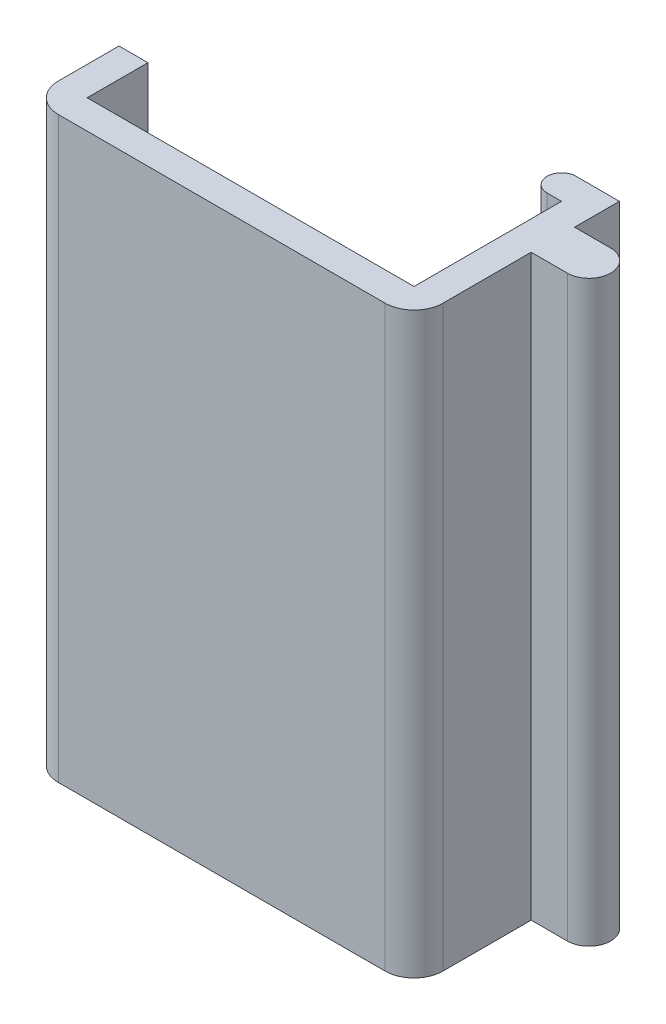
ISO-10303-21;
HEADER;
FILE_DESCRIPTION(('STEP AP214'),'2;1');
FILE_NAME('part.step','',(''),(''),'','','');
FILE_SCHEMA(('AUTOMOTIVE_DESIGN { 1 0 10303 214 1 1 1 1 }'));
ENDSEC;
DATA;
#1=APPLICATION_CONTEXT('core data for automotive mechanical design processes');
#2=APPLICATION_PROTOCOL_DEFINITION('international standard','automotive_design',2000,#1);
#3=PRODUCT_CONTEXT('',#1,'mechanical');
#4=PRODUCT('Part','Part','',(#3));
#5=PRODUCT_RELATED_PRODUCT_CATEGORY('part','',(#4));
#6=PRODUCT_DEFINITION_FORMATION('','',#4);
#7=PRODUCT_DEFINITION_CONTEXT('part definition',#1,'design');
#8=PRODUCT_DEFINITION('design','',#6,#7);
#9=PRODUCT_DEFINITION_SHAPE('','',#8);
#10=(LENGTH_UNIT() NAMED_UNIT(*) SI_UNIT(.MILLI.,.METRE.));
#11=(NAMED_UNIT(*) PLANE_ANGLE_UNIT() SI_UNIT($,.RADIAN.));
#12=(NAMED_UNIT(*) SI_UNIT($,.STERADIAN.) SOLID_ANGLE_UNIT());
#13=UNCERTAINTY_MEASURE_WITH_UNIT(LENGTH_MEASURE(1.E-05),#10,'distance_accuracy_value','');
#14=(GEOMETRIC_REPRESENTATION_CONTEXT(3) GLOBAL_UNCERTAINTY_ASSIGNED_CONTEXT((#13)) GLOBAL_UNIT_ASSIGNED_CONTEXT((#10,
#11,#12)) REPRESENTATION_CONTEXT('',''));
#15=CARTESIAN_POINT('',(0.,0.,0.));
#16=DIRECTION('',(0.,0.,1.));
#17=DIRECTION('',(1.,0.,0.));
#18=AXIS2_PLACEMENT_3D('',#15,#16,#17);
#19=CARTESIAN_POINT('',(10.5325860268922,20.,-1.7));
#20=DIRECTION('',(0.,1.,0.));
#21=DIRECTION('',(0.,0.,1.));
#22=AXIS2_PLACEMENT_3D('',#19,#20,#21);
#23=CYLINDRICAL_SURFACE('',#22,0.75);
#24=DIRECTION('',(0.,-1.,0.));
#25=VECTOR('',#24,1.);
#26=CARTESIAN_POINT('',(10.5325860268922,20.,-2.45));
#27=LINE('',#26,#25);
#28=CARTESIAN_POINT('',(10.5325860268922,20.,-2.45));
#29=VERTEX_POINT('',#28);
#30=CARTESIAN_POINT('',(10.5325860268922,0.,-2.45000000000001));
#31=VERTEX_POINT('',#30);
#32=EDGE_CURVE('E157',#29,#31,#27,.T.);
#33=ORIENTED_EDGE('',*,*,#32,.F.);
#34=CARTESIAN_POINT('',(10.5325860268922,20.,-1.7));
#35=DIRECTION('',(0.,1.,0.));
#36=DIRECTION('',(0.,0.,1.));
#37=AXIS2_PLACEMENT_3D('',#34,#35,#36);
#38=CIRCLE('',#37,0.75);
#39=CARTESIAN_POINT('',(10.5325860268922,20.,-0.950000000000003));
#40=VERTEX_POINT('',#39);
#41=EDGE_CURVE('E49',#40,#29,#38,.T.);
#42=ORIENTED_EDGE('',*,*,#41,.F.);
#43=DIRECTION('',(0.,-1.,0.));
#44=VECTOR('',#43,1.);
#45=CARTESIAN_POINT('',(10.5325860268922,20.,-0.950000000000003));
#46=LINE('',#45,#44);
#47=CARTESIAN_POINT('',(10.5325860268922,0.,-0.950000000000003));
#48=VERTEX_POINT('',#47);
#49=EDGE_CURVE('E271',#48,#40,#46,.F.);
#50=ORIENTED_EDGE('',*,*,#49,.F.);
#51=CARTESIAN_POINT('',(10.5325860268922,0.,-1.70000000000001));
#52=DIRECTION('',(0.,1.,0.));
#53=DIRECTION('',(0.,0.,1.));
#54=AXIS2_PLACEMENT_3D('',#51,#52,#53);
#55=CIRCLE('',#54,0.75);
#56=EDGE_CURVE('E11',#31,#48,#55,.F.);
#57=ORIENTED_EDGE('',*,*,#56,.F.);
#58=EDGE_LOOP('',(#33,#42,#50,#57));
#59=FACE_BOUND('',#58,.T.);
#60=ADVANCED_FACE('F41',(#59),#23,.T.);
#61=CARTESIAN_POINT('',(9.28258602689219,20.,3.1));
#62=DIRECTION('',(-1.,0.,0.));
#63=DIRECTION('',(0.,0.,1.));
#64=AXIS2_PLACEMENT_3D('',#61,#62,#63);
#65=PLANE('',#64);
#66=DIRECTION('',(0.,-1.,0.));
#67=VECTOR('',#66,1.);
#68=CARTESIAN_POINT('',(9.28258602689219,20.,-0.950000000000003));
#69=LINE('',#68,#67);
#70=CARTESIAN_POINT('',(9.28258602689218,20.,-0.950000000000002));
#71=VERTEX_POINT('',#70);
#72=CARTESIAN_POINT('',(9.28258602689218,0.,-0.950000000000002));
#73=VERTEX_POINT('',#72);
#74=EDGE_CURVE('E176',#71,#73,#69,.T.);
#75=ORIENTED_EDGE('',*,*,#74,.F.);
#76=DIRECTION('',(0.,0.,-1.));
#77=VECTOR('',#76,1.);
#78=CARTESIAN_POINT('',(9.28258602689219,20.,3.1));
#79=LINE('',#78,#77);
#80=CARTESIAN_POINT('',(9.28258602689219,20.,2.1));
#81=VERTEX_POINT('',#80);
#82=EDGE_CURVE('E197',#81,#71,#79,.T.);
#83=ORIENTED_EDGE('',*,*,#82,.F.);
#84=DIRECTION('',(0.,1.,0.));
#85=VECTOR('',#84,1.);
#86=CARTESIAN_POINT('',(9.28258602689219,20.,2.1));
#87=LINE('',#86,#85);
#88=CARTESIAN_POINT('',(9.28258602689219,0.,2.1));
#89=VERTEX_POINT('',#88);
#90=EDGE_CURVE('E263',#81,#89,#87,.F.);
#91=ORIENTED_EDGE('',*,*,#90,.T.);
#92=DIRECTION('',(0.,0.,-1.));
#93=VECTOR('',#92,1.);
#94=CARTESIAN_POINT('',(9.28258602689219,0.,3.1));
#95=LINE('',#94,#93);
#96=EDGE_CURVE('E169',#89,#73,#95,.T.);
#97=ORIENTED_EDGE('',*,*,#96,.T.);
#98=EDGE_LOOP('',(#75,#83,#91,#97));
#99=FACE_BOUND('',#98,.T.);
#100=ADVANCED_FACE('F281',(#99),#65,.F.);
#101=DIRECTION('',(0.,1.,0.));
#102=VECTOR('',#101,1.);
#103=CARTESIAN_POINT('',(9.28258602689219,20.,-2.45));
#104=LINE('',#103,#102);
#105=CARTESIAN_POINT('',(9.28258602689219,0.,-2.45000000000001));
#106=VERTEX_POINT('',#105);
#107=CARTESIAN_POINT('',(9.28258602689218,20.,-2.45));
#108=VERTEX_POINT('',#107);
#109=EDGE_CURVE('E156',#106,#108,#104,.T.);
#110=ORIENTED_EDGE('',*,*,#109,.F.);
#111=CARTESIAN_POINT('',(9.28258602689218,0.,-4.));
#112=VERTEX_POINT('',#111);
#113=EDGE_CURVE('E162',#106,#112,#95,.T.);
#114=ORIENTED_EDGE('',*,*,#113,.T.);
#115=DIRECTION('',(0.,-1.,0.));
#116=VECTOR('',#115,1.);
#117=CARTESIAN_POINT('',(9.28258602689218,20.,-4.));
#118=LINE('',#117,#116);
#119=CARTESIAN_POINT('',(9.28258602689218,20.,-4.));
#120=VERTEX_POINT('',#119);
#121=EDGE_CURVE('E235',#120,#112,#118,.T.);
#122=ORIENTED_EDGE('',*,*,#121,.F.);
#123=EDGE_CURVE('E174',#108,#120,#79,.T.);
#124=ORIENTED_EDGE('',*,*,#123,.F.);
#125=EDGE_LOOP('',(#110,#114,#122,#124));
#126=FACE_BOUND('',#125,.T.);
#127=ADVANCED_FACE('F173',(#126),#65,.F.);
#128=CARTESIAN_POINT('',(8.28258602689219,20.,2.1));
#129=DIRECTION('',(0.,1.,0.));
#130=DIRECTION('',(0.,0.,1.));
#131=AXIS2_PLACEMENT_3D('',#128,#129,#130);
#132=CYLINDRICAL_SURFACE('',#131,1.);
#133=DIRECTION('',(0.,1.,0.));
#134=VECTOR('',#133,1.);
#135=CARTESIAN_POINT('',(8.28258602689219,20.,3.1));
#136=LINE('',#135,#134);
#137=CARTESIAN_POINT('',(8.28258602689219,0.,3.1));
#138=VERTEX_POINT('',#137);
#139=CARTESIAN_POINT('',(8.28258602689219,20.,3.1));
#140=VERTEX_POINT('',#139);
#141=EDGE_CURVE('E260',#138,#140,#136,.T.);
#142=ORIENTED_EDGE('',*,*,#141,.F.);
#143=CARTESIAN_POINT('',(8.28258602689219,0.,2.1));
#144=DIRECTION('',(0.,1.,0.));
#145=DIRECTION('',(0.,0.,1.));
#146=AXIS2_PLACEMENT_3D('',#143,#144,#145);
#147=CIRCLE('',#146,1.);
#148=EDGE_CURVE('E266',#89,#138,#147,.F.);
#149=ORIENTED_EDGE('',*,*,#148,.F.);
#150=ORIENTED_EDGE('',*,*,#90,.F.);
#151=CARTESIAN_POINT('',(8.28258602689219,20.,2.1));
#152=DIRECTION('',(0.,1.,0.));
#153=DIRECTION('',(0.,0.,1.));
#154=AXIS2_PLACEMENT_3D('',#151,#152,#153);
#155=CIRCLE('',#154,1.);
#156=EDGE_CURVE('E268',#140,#81,#155,.T.);
#157=ORIENTED_EDGE('',*,*,#156,.F.);
#158=EDGE_LOOP('',(#142,#149,#150,#157));
#159=FACE_BOUND('',#158,.T.);
#160=ADVANCED_FACE('F286',(#159),#132,.T.);
#161=CARTESIAN_POINT('',(-3.01741397310781,20.,2.1));
#162=DIRECTION('',(0.,1.,0.));
#163=DIRECTION('',(0.,0.,1.));
#164=AXIS2_PLACEMENT_3D('',#161,#162,#163);
#165=CYLINDRICAL_SURFACE('',#164,1.);
#166=DIRECTION('',(0.,1.,0.));
#167=VECTOR('',#166,1.);
#168=CARTESIAN_POINT('',(-4.01741397310781,20.,2.1));
#169=LINE('',#168,#167);
#170=CARTESIAN_POINT('',(-4.01741397310781,0.,2.1));
#171=VERTEX_POINT('',#170);
#172=CARTESIAN_POINT('',(-4.01741397310781,20.,2.1));
#173=VERTEX_POINT('',#172);
#174=EDGE_CURVE('E250',#171,#173,#169,.T.);
#175=ORIENTED_EDGE('',*,*,#174,.F.);
#176=CARTESIAN_POINT('',(-3.01741397310781,0.,2.1));
#177=DIRECTION('',(0.,1.,0.));
#178=DIRECTION('',(0.,0.,1.));
#179=AXIS2_PLACEMENT_3D('',#176,#177,#178);
#180=CIRCLE('',#179,1.);
#181=CARTESIAN_POINT('',(-3.01741397310781,0.,3.1));
#182=VERTEX_POINT('',#181);
#183=EDGE_CURVE('E256',#182,#171,#180,.F.);
#184=ORIENTED_EDGE('',*,*,#183,.F.);
#185=DIRECTION('',(0.,1.,0.));
#186=VECTOR('',#185,1.);
#187=CARTESIAN_POINT('',(-3.01741397310781,20.,3.1));
#188=LINE('',#187,#186);
#189=CARTESIAN_POINT('',(-3.01741397310781,20.,3.1));
#190=VERTEX_POINT('',#189);
#191=EDGE_CURVE('E253',#190,#182,#188,.F.);
#192=ORIENTED_EDGE('',*,*,#191,.F.);
#193=CARTESIAN_POINT('',(-3.01741397310781,20.,2.1));
#194=DIRECTION('',(0.,1.,0.));
#195=DIRECTION('',(0.,0.,1.));
#196=AXIS2_PLACEMENT_3D('',#193,#194,#195);
#197=CIRCLE('',#196,1.);
#198=EDGE_CURVE('E258',#173,#190,#197,.T.);
#199=ORIENTED_EDGE('',*,*,#198,.F.);
#200=EDGE_LOOP('',(#175,#184,#192,#199));
#201=FACE_BOUND('',#200,.T.);
#202=ADVANCED_FACE('F295',(#201),#165,.T.);
#203=CARTESIAN_POINT('',(7.78258602689218,20.,-3.5));
#204=DIRECTION('',(0.,-1.,0.));
#205=DIRECTION('',(0.,0.,-1.));
#206=AXIS2_PLACEMENT_3D('',#203,#204,#205);
#207=CYLINDRICAL_SURFACE('',#206,0.5);
#208=DIRECTION('',(0.,-1.,0.));
#209=VECTOR('',#208,1.);
#210=CARTESIAN_POINT('',(7.78258602689218,20.,-3.));
#211=LINE('',#210,#209);
#212=CARTESIAN_POINT('',(7.78258602689218,20.,-3.));
#213=VERTEX_POINT('',#212);
#214=CARTESIAN_POINT('',(7.78258602689218,0.,-3.));
#215=VERTEX_POINT('',#214);
#216=EDGE_CURVE('E240',#213,#215,#211,.T.);
#217=ORIENTED_EDGE('',*,*,#216,.F.);
#218=CARTESIAN_POINT('',(7.78258602689218,20.,-3.5));
#219=DIRECTION('',(0.,1.,0.));
#220=DIRECTION('',(0.,0.,1.));
#221=AXIS2_PLACEMENT_3D('',#218,#219,#220);
#222=CIRCLE('',#221,0.5);
#223=CARTESIAN_POINT('',(7.78258602689218,20.,-4.));
#224=VERTEX_POINT('',#223);
#225=EDGE_CURVE('E246',#224,#213,#222,.T.);
#226=ORIENTED_EDGE('',*,*,#225,.F.);
#227=DIRECTION('',(0.,-1.,0.));
#228=VECTOR('',#227,1.);
#229=CARTESIAN_POINT('',(7.78258602689218,20.,-4.));
#230=LINE('',#229,#228);
#231=CARTESIAN_POINT('',(7.78258602689218,0.,-4.));
#232=VERTEX_POINT('',#231);
#233=EDGE_CURVE('E243',#232,#224,#230,.F.);
#234=ORIENTED_EDGE('',*,*,#233,.F.);
#235=CARTESIAN_POINT('',(7.78258602689218,0.,-3.5));
#236=DIRECTION('',(0.,1.,0.));
#237=DIRECTION('',(0.,0.,1.));
#238=AXIS2_PLACEMENT_3D('',#235,#236,#237);
#239=CIRCLE('',#238,0.5);
#240=EDGE_CURVE('E248',#215,#232,#239,.F.);
#241=ORIENTED_EDGE('',*,*,#240,.F.);
#242=EDGE_LOOP('',(#217,#226,#234,#241));
#243=FACE_BOUND('',#242,.T.);
#244=ADVANCED_FACE('F326',(#243),#207,.T.);
#245=CARTESIAN_POINT('',(-2.72628125739327,20.,0.));
#246=DIRECTION('',(0.,0.,1.));
#247=DIRECTION('',(1.,0.,0.));
#248=AXIS2_PLACEMENT_3D('',#245,#246,#247);
#249=PLANE('',#248);
#250=DIRECTION('',(-1.,0.,0.));
#251=VECTOR('',#250,1.);
#252=CARTESIAN_POINT('',(-2.72628125739327,20.,0.));
#253=LINE('',#252,#251);
#254=CARTESIAN_POINT('',(-3.01741397310781,20.,0.));
#255=VERTEX_POINT('',#254);
#256=CARTESIAN_POINT('',(-4.01741397310781,20.,0.));
#257=VERTEX_POINT('',#256);
#258=EDGE_CURVE('E188',#255,#257,#253,.T.);
#259=ORIENTED_EDGE('',*,*,#258,.F.);
#260=DIRECTION('',(0.,-1.,0.));
#261=VECTOR('',#260,1.);
#262=CARTESIAN_POINT('',(-3.01741397310781,20.,0.));
#263=LINE('',#262,#261);
#264=CARTESIAN_POINT('',(-3.01741397310781,0.,0.));
#265=VERTEX_POINT('',#264);
#266=EDGE_CURVE('E184',#255,#265,#263,.T.);
#267=ORIENTED_EDGE('',*,*,#266,.T.);
#268=DIRECTION('',(-1.,0.,0.));
#269=VECTOR('',#268,1.);
#270=CARTESIAN_POINT('',(-2.72628125739327,0.,0.));
#271=LINE('',#270,#269);
#272=CARTESIAN_POINT('',(-4.01741397310781,0.,0.));
#273=VERTEX_POINT('',#272);
#274=EDGE_CURVE('E187',#265,#273,#271,.T.);
#275=ORIENTED_EDGE('',*,*,#274,.T.);
#276=DIRECTION('',(0.,-1.,0.));
#277=VECTOR('',#276,1.);
#278=CARTESIAN_POINT('',(-4.01741397310781,20.,0.));
#279=LINE('',#278,#277);
#280=EDGE_CURVE('E237',#257,#273,#279,.T.);
#281=ORIENTED_EDGE('',*,*,#280,.F.);
#282=EDGE_LOOP('',(#259,#267,#275,#281));
#283=FACE_BOUND('',#282,.T.);
#284=ADVANCED_FACE('F305',(#283),#249,.F.);
#285=CARTESIAN_POINT('',(-4.01741397310781,20.,0.));
#286=DIRECTION('',(1.,0.,0.));
#287=DIRECTION('',(0.,0.,-1.));
#288=AXIS2_PLACEMENT_3D('',#285,#286,#287);
#289=PLANE('',#288);
#290=DIRECTION('',(0.,0.,1.));
#291=VECTOR('',#290,1.);
#292=CARTESIAN_POINT('',(-4.01741397310781,0.,0.));
#293=LINE('',#292,#291);
#294=EDGE_CURVE('E213',#273,#171,#293,.T.);
#295=ORIENTED_EDGE('',*,*,#294,.T.);
#296=ORIENTED_EDGE('',*,*,#174,.T.);
#297=DIRECTION('',(0.,0.,1.));
#298=VECTOR('',#297,1.);
#299=CARTESIAN_POINT('',(-4.01741397310781,20.,0.));
#300=LINE('',#299,#298);
#301=EDGE_CURVE('E190',#257,#173,#300,.T.);
#302=ORIENTED_EDGE('',*,*,#301,.F.);
#303=ORIENTED_EDGE('',*,*,#280,.T.);
#304=EDGE_LOOP('',(#295,#296,#302,#303));
#305=FACE_BOUND('',#304,.T.);
#306=ADVANCED_FACE('F298',(#305),#289,.F.);
#307=CARTESIAN_POINT('',(-4.01741397310781,20.,3.1));
#308=DIRECTION('',(0.,0.,-1.));
#309=DIRECTION('',(-1.,0.,0.));
#310=AXIS2_PLACEMENT_3D('',#307,#308,#309);
#311=PLANE('',#310);
#312=DIRECTION('',(1.,0.,0.));
#313=VECTOR('',#312,1.);
#314=CARTESIAN_POINT('',(-4.01741397310781,0.,3.1));
#315=LINE('',#314,#313);
#316=EDGE_CURVE('E170',#182,#138,#315,.T.);
#317=ORIENTED_EDGE('',*,*,#316,.T.);
#318=ORIENTED_EDGE('',*,*,#141,.T.);
#319=DIRECTION('',(1.,0.,0.));
#320=VECTOR('',#319,1.);
#321=CARTESIAN_POINT('',(-4.01741397310781,20.,3.1));
#322=LINE('',#321,#320);
#323=EDGE_CURVE('E194',#190,#140,#322,.T.);
#324=ORIENTED_EDGE('',*,*,#323,.F.);
#325=ORIENTED_EDGE('',*,*,#191,.T.);
#326=EDGE_LOOP('',(#317,#318,#324,#325));
#327=FACE_BOUND('',#326,.T.);
#328=ADVANCED_FACE('F291',(#327),#311,.F.);
#329=CARTESIAN_POINT('',(9.28258602689218,20.,-4.));
#330=DIRECTION('',(0.,0.,1.));
#331=DIRECTION('',(1.,0.,0.));
#332=AXIS2_PLACEMENT_3D('',#329,#330,#331);
#333=PLANE('',#332);
#334=DIRECTION('',(-1.,0.,0.));
#335=VECTOR('',#334,1.);
#336=CARTESIAN_POINT('',(9.28258602689218,0.,-4.));
#337=LINE('',#336,#335);
#338=EDGE_CURVE('E165',#112,#232,#337,.T.);
#339=ORIENTED_EDGE('',*,*,#338,.T.);
#340=ORIENTED_EDGE('',*,*,#233,.T.);
#341=DIRECTION('',(-1.,0.,0.));
#342=VECTOR('',#341,1.);
#343=CARTESIAN_POINT('',(9.28258602689218,20.,-4.));
#344=LINE('',#343,#342);
#345=EDGE_CURVE('E200',#120,#224,#344,.T.);
#346=ORIENTED_EDGE('',*,*,#345,.F.);
#347=ORIENTED_EDGE('',*,*,#121,.T.);
#348=EDGE_LOOP('',(#339,#340,#346,#347));
#349=FACE_BOUND('',#348,.T.);
#350=ADVANCED_FACE('F330',(#349),#333,.F.);
#351=CARTESIAN_POINT('',(7.28258602689218,20.,-3.));
#352=DIRECTION('',(0.,0.,-1.));
#353=DIRECTION('',(-1.,0.,0.));
#354=AXIS2_PLACEMENT_3D('',#351,#352,#353);
#355=PLANE('',#354);
#356=DIRECTION('',(1.,0.,0.));
#357=VECTOR('',#356,1.);
#358=CARTESIAN_POINT('',(7.28258602689218,20.,-3.));
#359=LINE('',#358,#357);
#360=CARTESIAN_POINT('',(8.28258602689218,20.,-3.));
#361=VERTEX_POINT('',#360);
#362=EDGE_CURVE('E203',#213,#361,#359,.T.);
#363=ORIENTED_EDGE('',*,*,#362,.F.);
#364=ORIENTED_EDGE('',*,*,#216,.T.);
#365=DIRECTION('',(1.,0.,0.));
#366=VECTOR('',#365,1.);
#367=CARTESIAN_POINT('',(7.28258602689218,0.,-3.));
#368=LINE('',#367,#366);
#369=CARTESIAN_POINT('',(8.28258602689218,0.,-3.));
#370=VERTEX_POINT('',#369);
#371=EDGE_CURVE('E220',#215,#370,#368,.T.);
#372=ORIENTED_EDGE('',*,*,#371,.T.);
#373=DIRECTION('',(0.,-1.,0.));
#374=VECTOR('',#373,1.);
#375=CARTESIAN_POINT('',(8.28258602689218,20.,-3.));
#376=LINE('',#375,#374);
#377=EDGE_CURVE('E232',#361,#370,#376,.T.);
#378=ORIENTED_EDGE('',*,*,#377,.F.);
#379=EDGE_LOOP('',(#363,#364,#372,#378));
#380=FACE_BOUND('',#379,.T.);
#381=ADVANCED_FACE('F323',(#380),#355,.F.);
#382=CARTESIAN_POINT('',(8.28258602689218,20.,-3.));
#383=DIRECTION('',(1.,0.,0.));
#384=DIRECTION('',(0.,0.,-1.));
#385=AXIS2_PLACEMENT_3D('',#382,#383,#384);
#386=PLANE('',#385);
#387=DIRECTION('',(0.,0.,1.));
#388=VECTOR('',#387,1.);
#389=CARTESIAN_POINT('',(8.28258602689218,0.,-3.));
#390=LINE('',#389,#388);
#391=CARTESIAN_POINT('',(8.28258602689218,0.,2.1));
#392=VERTEX_POINT('',#391);
#393=EDGE_CURVE('E222',#370,#392,#390,.T.);
#394=ORIENTED_EDGE('',*,*,#393,.T.);
#395=DIRECTION('',(0.,-1.,0.));
#396=VECTOR('',#395,1.);
#397=CARTESIAN_POINT('',(8.28258602689218,20.,2.1));
#398=LINE('',#397,#396);
#399=CARTESIAN_POINT('',(8.28258602689218,20.,2.1));
#400=VERTEX_POINT('',#399);
#401=EDGE_CURVE('E229',#400,#392,#398,.T.);
#402=ORIENTED_EDGE('',*,*,#401,.F.);
#403=DIRECTION('',(0.,0.,1.));
#404=VECTOR('',#403,1.);
#405=CARTESIAN_POINT('',(8.28258602689218,20.,-3.));
#406=LINE('',#405,#404);
#407=EDGE_CURVE('E205',#361,#400,#406,.T.);
#408=ORIENTED_EDGE('',*,*,#407,.F.);
#409=ORIENTED_EDGE('',*,*,#377,.T.);
#410=EDGE_LOOP('',(#394,#402,#408,#409));
#411=FACE_BOUND('',#410,.T.);
#412=ADVANCED_FACE('F318',(#411),#386,.F.);
#413=CARTESIAN_POINT('',(8.28258602689218,20.,2.1));
#414=DIRECTION('',(0.,0.,1.));
#415=DIRECTION('',(1.,0.,0.));
#416=AXIS2_PLACEMENT_3D('',#413,#414,#415);
#417=PLANE('',#416);
#418=DIRECTION('',(-1.,0.,0.));
#419=VECTOR('',#418,1.);
#420=CARTESIAN_POINT('',(8.28258602689218,0.,2.1));
#421=LINE('',#420,#419);
#422=CARTESIAN_POINT('',(-3.01741397310781,0.,2.1));
#423=VERTEX_POINT('',#422);
#424=EDGE_CURVE('E224',#392,#423,#421,.T.);
#425=ORIENTED_EDGE('',*,*,#424,.T.);
#426=DIRECTION('',(0.,-1.,0.));
#427=VECTOR('',#426,1.);
#428=CARTESIAN_POINT('',(-3.01741397310781,20.,2.1));
#429=LINE('',#428,#427);
#430=CARTESIAN_POINT('',(-3.01741397310781,20.,2.1));
#431=VERTEX_POINT('',#430);
#432=EDGE_CURVE('E211',#431,#423,#429,.T.);
#433=ORIENTED_EDGE('',*,*,#432,.F.);
#434=DIRECTION('',(-1.,0.,0.));
#435=VECTOR('',#434,1.);
#436=CARTESIAN_POINT('',(8.28258602689218,20.,2.1));
#437=LINE('',#436,#435);
#438=EDGE_CURVE('E207',#400,#431,#437,.T.);
#439=ORIENTED_EDGE('',*,*,#438,.F.);
#440=ORIENTED_EDGE('',*,*,#401,.T.);
#441=EDGE_LOOP('',(#425,#433,#439,#440));
#442=FACE_BOUND('',#441,.T.);
#443=ADVANCED_FACE('F313',(#442),#417,.F.);
#444=CARTESIAN_POINT('',(-3.01741397310781,20.,2.1));
#445=DIRECTION('',(-1.,0.,0.));
#446=DIRECTION('',(0.,0.,1.));
#447=AXIS2_PLACEMENT_3D('',#444,#445,#446);
#448=PLANE('',#447);
#449=DIRECTION('',(0.,0.,-1.));
#450=VECTOR('',#449,1.);
#451=CARTESIAN_POINT('',(-3.01741397310781,0.,2.1));
#452=LINE('',#451,#450);
#453=EDGE_CURVE('E191',#423,#265,#452,.T.);
#454=ORIENTED_EDGE('',*,*,#453,.T.);
#455=ORIENTED_EDGE('',*,*,#266,.F.);
#456=DIRECTION('',(0.,0.,-1.));
#457=VECTOR('',#456,1.);
#458=CARTESIAN_POINT('',(-3.01741397310781,20.,2.1));
#459=LINE('',#458,#457);
#460=EDGE_CURVE('E209',#431,#255,#459,.T.);
#461=ORIENTED_EDGE('',*,*,#460,.F.);
#462=ORIENTED_EDGE('',*,*,#432,.T.);
#463=EDGE_LOOP('',(#454,#455,#461,#462));
#464=FACE_BOUND('',#463,.T.);
#465=ADVANCED_FACE('F309',(#464),#448,.F.);
#466=CARTESIAN_POINT('',(0.,20.,0.));
#467=DIRECTION('',(0.,1.,0.));
#468=DIRECTION('',(0.,0.,1.));
#469=AXIS2_PLACEMENT_3D('',#466,#467,#468);
#470=PLANE('',#469);
#471=DIRECTION('',(-1.,0.,0.));
#472=VECTOR('',#471,1.);
#473=CARTESIAN_POINT('',(11.2825860268922,20.,-0.950000000000003));
#474=LINE('',#473,#472);
#475=EDGE_CURVE('E175',#40,#71,#474,.T.);
#476=ORIENTED_EDGE('',*,*,#475,.F.);
#477=ORIENTED_EDGE('',*,*,#41,.T.);
#478=DIRECTION('',(-1.,0.,0.));
#479=VECTOR('',#478,1.);
#480=CARTESIAN_POINT('',(11.2825860268922,20.,-2.45));
#481=LINE('',#480,#479);
#482=EDGE_CURVE('E159',#29,#108,#481,.T.);
#483=ORIENTED_EDGE('',*,*,#482,.T.);
#484=ORIENTED_EDGE('',*,*,#123,.T.);
#485=ORIENTED_EDGE('',*,*,#345,.T.);
#486=ORIENTED_EDGE('',*,*,#225,.T.);
#487=ORIENTED_EDGE('',*,*,#362,.T.);
#488=ORIENTED_EDGE('',*,*,#407,.T.);
#489=ORIENTED_EDGE('',*,*,#438,.T.);
#490=ORIENTED_EDGE('',*,*,#460,.T.);
#491=ORIENTED_EDGE('',*,*,#258,.T.);
#492=ORIENTED_EDGE('',*,*,#301,.T.);
#493=ORIENTED_EDGE('',*,*,#198,.T.);
#494=ORIENTED_EDGE('',*,*,#323,.T.);
#495=ORIENTED_EDGE('',*,*,#156,.T.);
#496=ORIENTED_EDGE('',*,*,#82,.T.);
#497=EDGE_LOOP('',(#476,#477,#483,#484,#485,#486,#487,#488,#489,#490,#491,#492,#493,#494,#495,#496));
#498=FACE_BOUND('',#497,.T.);
#499=ADVANCED_FACE('F274',(#498),#470,.T.);
#500=CARTESIAN_POINT('',(0.,0.,0.));
#501=DIRECTION('',(0.,1.,0.));
#502=DIRECTION('',(0.,0.,1.));
#503=AXIS2_PLACEMENT_3D('',#500,#501,#502);
#504=PLANE('',#503);
#505=DIRECTION('',(-1.,0.,0.));
#506=VECTOR('',#505,1.);
#507=CARTESIAN_POINT('',(11.2825860268922,0.,-2.45000000000001));
#508=LINE('',#507,#506);
#509=EDGE_CURVE('E151',#31,#106,#508,.T.);
#510=ORIENTED_EDGE('',*,*,#509,.F.);
#511=ORIENTED_EDGE('',*,*,#56,.T.);
#512=DIRECTION('',(-1.,0.,0.));
#513=VECTOR('',#512,1.);
#514=CARTESIAN_POINT('',(11.2825860268922,0.,-0.950000000000003));
#515=LINE('',#514,#513);
#516=EDGE_CURVE('E158',#48,#73,#515,.T.);
#517=ORIENTED_EDGE('',*,*,#516,.T.);
#518=ORIENTED_EDGE('',*,*,#96,.F.);
#519=ORIENTED_EDGE('',*,*,#148,.T.);
#520=ORIENTED_EDGE('',*,*,#316,.F.);
#521=ORIENTED_EDGE('',*,*,#183,.T.);
#522=ORIENTED_EDGE('',*,*,#294,.F.);
#523=ORIENTED_EDGE('',*,*,#274,.F.);
#524=ORIENTED_EDGE('',*,*,#453,.F.);
#525=ORIENTED_EDGE('',*,*,#424,.F.);
#526=ORIENTED_EDGE('',*,*,#393,.F.);
#527=ORIENTED_EDGE('',*,*,#371,.F.);
#528=ORIENTED_EDGE('',*,*,#240,.T.);
#529=ORIENTED_EDGE('',*,*,#338,.F.);
#530=ORIENTED_EDGE('',*,*,#113,.F.);
#531=EDGE_LOOP('',(#510,#511,#517,#518,#519,#520,#521,#522,#523,#524,#525,#526,#527,#528,#529,#530));
#532=FACE_BOUND('',#531,.T.);
#533=ADVANCED_FACE('F163',(#532),#504,.F.);
#534=CARTESIAN_POINT('',(11.2825860268922,20.,-0.950000000000003));
#535=DIRECTION('',(0.,0.,-1.));
#536=DIRECTION('',(-1.,0.,0.));
#537=AXIS2_PLACEMENT_3D('',#534,#535,#536);
#538=PLANE('',#537);
#539=ORIENTED_EDGE('',*,*,#516,.F.);
#540=ORIENTED_EDGE('',*,*,#49,.T.);
#541=ORIENTED_EDGE('',*,*,#475,.T.);
#542=ORIENTED_EDGE('',*,*,#74,.T.);
#543=EDGE_LOOP('',(#539,#540,#541,#542));
#544=FACE_BOUND('',#543,.T.);
#545=ADVANCED_FACE('F277',(#544),#538,.F.);
#546=CARTESIAN_POINT('',(11.2825860268922,20.,-2.45));
#547=DIRECTION('',(0.,0.,1.));
#548=DIRECTION('',(0.,-1.,0.));
#549=AXIS2_PLACEMENT_3D('',#546,#547,#548);
#550=PLANE('',#549);
#551=ORIENTED_EDGE('',*,*,#482,.F.);
#552=ORIENTED_EDGE('',*,*,#32,.T.);
#553=ORIENTED_EDGE('',*,*,#509,.T.);
#554=ORIENTED_EDGE('',*,*,#109,.T.);
#555=EDGE_LOOP('',(#551,#552,#553,#554));
#556=FACE_BOUND('',#555,.T.);
#557=ADVANCED_FACE('F154',(#556),#550,.F.);
#558=CLOSED_SHELL('',(#60,#100,#127,#160,#202,#244,#284,#306,#328,#350,#381,#412,#443,#465,#499,
#533,#545,#557));
#559=MANIFOLD_SOLID_BREP('B2',#558);
#560=ADVANCED_BREP_SHAPE_REPRESENTATION('',(#18,#559),#14);
#561=SHAPE_DEFINITION_REPRESENTATION(#9,#560);
ENDSEC;
END-ISO-10303-21;
